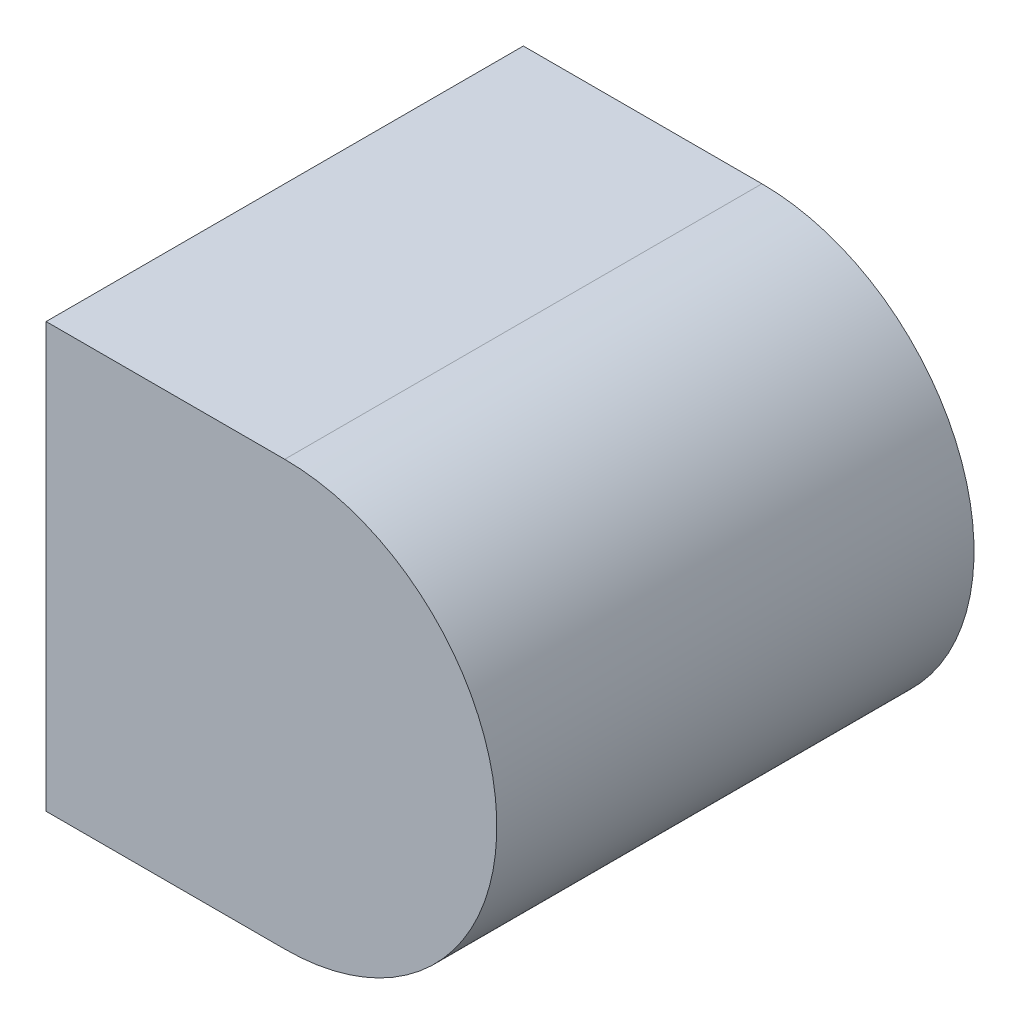
ISO-10303-21;
HEADER;
FILE_DESCRIPTION(('STEP AP214'),'2;1');
FILE_NAME('part.step','',(''),(''),'','','');
FILE_SCHEMA(('AUTOMOTIVE_DESIGN { 1 0 10303 214 1 1 1 1 }'));
ENDSEC;
DATA;
#1=APPLICATION_CONTEXT('core data for automotive mechanical design processes');
#2=APPLICATION_PROTOCOL_DEFINITION('international standard','automotive_design',2000,#1);
#3=PRODUCT_CONTEXT('',#1,'mechanical');
#4=PRODUCT('Part','Part','',(#3));
#5=PRODUCT_RELATED_PRODUCT_CATEGORY('part','',(#4));
#6=PRODUCT_DEFINITION_FORMATION('','',#4);
#7=PRODUCT_DEFINITION_CONTEXT('part definition',#1,'design');
#8=PRODUCT_DEFINITION('design','',#6,#7);
#9=PRODUCT_DEFINITION_SHAPE('','',#8);
#10=(LENGTH_UNIT() NAMED_UNIT(*) SI_UNIT(.MILLI.,.METRE.));
#11=(NAMED_UNIT(*) PLANE_ANGLE_UNIT() SI_UNIT($,.RADIAN.));
#12=(NAMED_UNIT(*) SI_UNIT($,.STERADIAN.) SOLID_ANGLE_UNIT());
#13=UNCERTAINTY_MEASURE_WITH_UNIT(LENGTH_MEASURE(1.E-05),#10,'distance_accuracy_value','');
#14=(GEOMETRIC_REPRESENTATION_CONTEXT(3) GLOBAL_UNCERTAINTY_ASSIGNED_CONTEXT((#13)) GLOBAL_UNIT_ASSIGNED_CONTEXT((#10,
#11,#12)) REPRESENTATION_CONTEXT('',''));
#15=CARTESIAN_POINT('',(0.,0.,0.));
#16=DIRECTION('',(0.,0.,1.));
#17=DIRECTION('',(1.,0.,0.));
#18=AXIS2_PLACEMENT_3D('',#15,#16,#17);
#19=CARTESIAN_POINT('',(0.,0.,114.3));
#20=DIRECTION('',(0.,0.,-1.));
#21=DIRECTION('',(-1.,0.,0.));
#22=AXIS2_PLACEMENT_3D('',#19,#20,#21);
#23=CYLINDRICAL_SURFACE('',#22,50.8);
#24=CARTESIAN_POINT('',(0.,0.,0.));
#25=DIRECTION('',(0.,0.,1.));
#26=DIRECTION('',(1.,0.,0.));
#27=AXIS2_PLACEMENT_3D('',#24,#25,#26);
#28=CIRCLE('',#27,50.8);
#29=CARTESIAN_POINT('',(0.,-50.8,0.));
#30=VERTEX_POINT('',#29);
#31=CARTESIAN_POINT('',(0.,50.8,0.));
#32=VERTEX_POINT('',#31);
#33=EDGE_CURVE('E97',#30,#32,#28,.T.);
#34=ORIENTED_EDGE('',*,*,#33,.T.);
#35=DIRECTION('',(0.,0.,-1.));
#36=VECTOR('',#35,1.);
#37=CARTESIAN_POINT('',(0.,50.8,114.3));
#38=LINE('',#37,#36);
#39=CARTESIAN_POINT('',(0.,50.8,114.3));
#40=VERTEX_POINT('',#39);
#41=EDGE_CURVE('E11',#40,#32,#38,.T.);
#42=ORIENTED_EDGE('',*,*,#41,.F.);
#43=CARTESIAN_POINT('',(0.,0.,114.3));
#44=DIRECTION('',(0.,0.,1.));
#45=DIRECTION('',(1.,0.,0.));
#46=AXIS2_PLACEMENT_3D('',#43,#44,#45);
#47=CIRCLE('',#46,50.8);
#48=CARTESIAN_POINT('',(0.,-50.8,114.3));
#49=VERTEX_POINT('',#48);
#50=EDGE_CURVE('E85',#49,#40,#47,.T.);
#51=ORIENTED_EDGE('',*,*,#50,.F.);
#52=DIRECTION('',(0.,0.,-1.));
#53=VECTOR('',#52,1.);
#54=CARTESIAN_POINT('',(0.,-50.8,114.3));
#55=LINE('',#54,#53);
#56=EDGE_CURVE('E93',#49,#30,#55,.T.);
#57=ORIENTED_EDGE('',*,*,#56,.T.);
#58=EDGE_LOOP('',(#34,#42,#51,#57));
#59=FACE_BOUND('',#58,.T.);
#60=ADVANCED_FACE('F34',(#59),#23,.T.);
#61=CARTESIAN_POINT('',(-57.15,50.8,114.3));
#62=DIRECTION('',(0.,-1.,0.));
#63=DIRECTION('',(1.,0.,0.));
#64=AXIS2_PLACEMENT_3D('',#61,#62,#63);
#65=PLANE('',#64);
#66=DIRECTION('',(-1.,0.,0.));
#67=VECTOR('',#66,1.);
#68=CARTESIAN_POINT('',(-57.15,50.8,0.));
#69=LINE('',#68,#67);
#70=CARTESIAN_POINT('',(-57.15,50.8,0.));
#71=VERTEX_POINT('',#70);
#72=EDGE_CURVE('E89',#32,#71,#69,.T.);
#73=ORIENTED_EDGE('',*,*,#72,.T.);
#74=DIRECTION('',(0.,0.,-1.));
#75=VECTOR('',#74,1.);
#76=CARTESIAN_POINT('',(-57.15,50.8,114.3));
#77=LINE('',#76,#75);
#78=CARTESIAN_POINT('',(-57.15,50.8,114.3));
#79=VERTEX_POINT('',#78);
#80=EDGE_CURVE('E42',#79,#71,#77,.T.);
#81=ORIENTED_EDGE('',*,*,#80,.F.);
#82=DIRECTION('',(-1.,0.,0.));
#83=VECTOR('',#82,1.);
#84=CARTESIAN_POINT('',(-57.15,50.8,114.3));
#85=LINE('',#84,#83);
#86=EDGE_CURVE('E80',#40,#79,#85,.T.);
#87=ORIENTED_EDGE('',*,*,#86,.F.);
#88=ORIENTED_EDGE('',*,*,#41,.T.);
#89=EDGE_LOOP('',(#73,#81,#87,#88));
#90=FACE_BOUND('',#89,.T.);
#91=ADVANCED_FACE('F88',(#90),#65,.F.);
#92=CARTESIAN_POINT('',(-57.15,-50.8,114.3));
#93=DIRECTION('',(1.,0.,0.));
#94=DIRECTION('',(0.,0.,-1.));
#95=AXIS2_PLACEMENT_3D('',#92,#93,#94);
#96=PLANE('',#95);
#97=DIRECTION('',(0.,-1.,0.));
#98=VECTOR('',#97,1.);
#99=CARTESIAN_POINT('',(-57.15,-50.8,0.));
#100=LINE('',#99,#98);
#101=CARTESIAN_POINT('',(-57.15,-50.8,0.));
#102=VERTEX_POINT('',#101);
#103=EDGE_CURVE('E67',#71,#102,#100,.T.);
#104=ORIENTED_EDGE('',*,*,#103,.T.);
#105=DIRECTION('',(0.,0.,-1.));
#106=VECTOR('',#105,1.);
#107=CARTESIAN_POINT('',(-57.15,-50.8,114.3));
#108=LINE('',#107,#106);
#109=CARTESIAN_POINT('',(-57.15,-50.8,114.3));
#110=VERTEX_POINT('',#109);
#111=EDGE_CURVE('E90',#110,#102,#108,.T.);
#112=ORIENTED_EDGE('',*,*,#111,.F.);
#113=DIRECTION('',(0.,-1.,0.));
#114=VECTOR('',#113,1.);
#115=CARTESIAN_POINT('',(-57.15,-50.8,114.3));
#116=LINE('',#115,#114);
#117=EDGE_CURVE('E83',#79,#110,#116,.T.);
#118=ORIENTED_EDGE('',*,*,#117,.F.);
#119=ORIENTED_EDGE('',*,*,#80,.T.);
#120=EDGE_LOOP('',(#104,#112,#118,#119));
#121=FACE_BOUND('',#120,.T.);
#122=ADVANCED_FACE('F91',(#121),#96,.F.);
#123=CARTESIAN_POINT('',(0.,-50.8,114.3));
#124=DIRECTION('',(0.,1.,0.));
#125=DIRECTION('',(-1.,0.,0.));
#126=AXIS2_PLACEMENT_3D('',#123,#124,#125);
#127=PLANE('',#126);
#128=DIRECTION('',(1.,0.,0.));
#129=VECTOR('',#128,1.);
#130=CARTESIAN_POINT('',(0.,-50.8,0.));
#131=LINE('',#130,#129);
#132=EDGE_CURVE('E73',#102,#30,#131,.T.);
#133=ORIENTED_EDGE('',*,*,#132,.T.);
#134=ORIENTED_EDGE('',*,*,#56,.F.);
#135=DIRECTION('',(1.,0.,0.));
#136=VECTOR('',#135,1.);
#137=CARTESIAN_POINT('',(0.,-50.8,114.3));
#138=LINE('',#137,#136);
#139=EDGE_CURVE('E50',#110,#49,#138,.T.);
#140=ORIENTED_EDGE('',*,*,#139,.F.);
#141=ORIENTED_EDGE('',*,*,#111,.T.);
#142=EDGE_LOOP('',(#133,#134,#140,#141));
#143=FACE_BOUND('',#142,.T.);
#144=ADVANCED_FACE('F104',(#143),#127,.F.);
#145=CARTESIAN_POINT('',(0.,0.,114.3));
#146=DIRECTION('',(0.,0.,1.));
#147=DIRECTION('',(1.,0.,0.));
#148=AXIS2_PLACEMENT_3D('',#145,#146,#147);
#149=PLANE('',#148);
#150=ORIENTED_EDGE('',*,*,#50,.T.);
#151=ORIENTED_EDGE('',*,*,#86,.T.);
#152=ORIENTED_EDGE('',*,*,#117,.T.);
#153=ORIENTED_EDGE('',*,*,#139,.T.);
#154=EDGE_LOOP('',(#150,#151,#152,#153));
#155=FACE_BOUND('',#154,.T.);
#156=ADVANCED_FACE('F81',(#155),#149,.T.);
#157=CARTESIAN_POINT('',(0.,0.,0.));
#158=DIRECTION('',(0.,0.,1.));
#159=DIRECTION('',(1.,0.,0.));
#160=AXIS2_PLACEMENT_3D('',#157,#158,#159);
#161=PLANE('',#160);
#162=ORIENTED_EDGE('',*,*,#33,.F.);
#163=ORIENTED_EDGE('',*,*,#132,.F.);
#164=ORIENTED_EDGE('',*,*,#103,.F.);
#165=ORIENTED_EDGE('',*,*,#72,.F.);
#166=EDGE_LOOP('',(#162,#163,#164,#165));
#167=FACE_BOUND('',#166,.T.);
#168=ADVANCED_FACE('F107',(#167),#161,.F.);
#169=CLOSED_SHELL('',(#60,#91,#122,#144,#156,#168));
#170=MANIFOLD_SOLID_BREP('B2',#169);
#171=ADVANCED_BREP_SHAPE_REPRESENTATION('',(#18,#170),#14);
#172=SHAPE_DEFINITION_REPRESENTATION(#9,#171);
ENDSEC;
END-ISO-10303-21;
